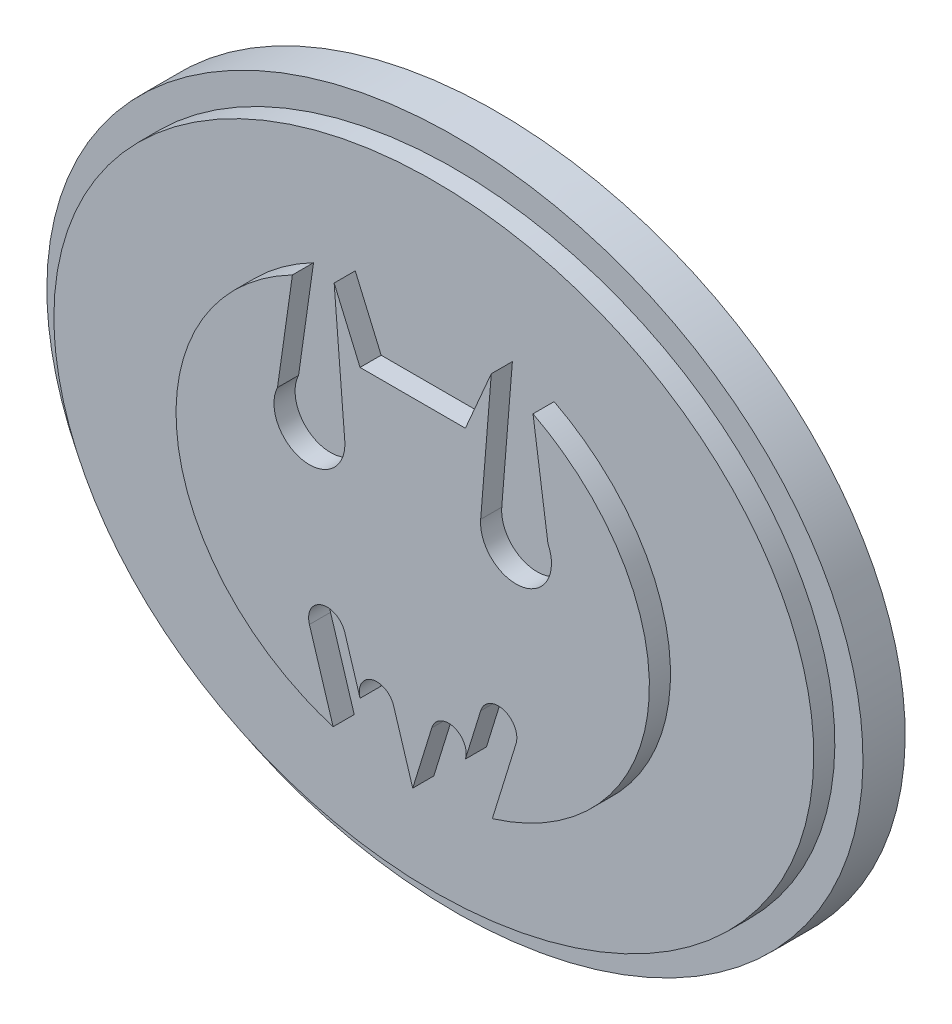
ISO-10303-21;
HEADER;
FILE_DESCRIPTION(('STEP AP214'),'2;1');
FILE_NAME('part.step','',(''),(''),'','','');
FILE_SCHEMA(('AUTOMOTIVE_DESIGN { 1 0 10303 214 1 1 1 1 }'));
ENDSEC;
DATA;
#1=APPLICATION_CONTEXT('core data for automotive mechanical design processes');
#2=APPLICATION_PROTOCOL_DEFINITION('international standard','automotive_design',2000,#1);
#3=PRODUCT_CONTEXT('',#1,'mechanical');
#4=PRODUCT('Part','Part','',(#3));
#5=PRODUCT_RELATED_PRODUCT_CATEGORY('part','',(#4));
#6=PRODUCT_DEFINITION_FORMATION('','',#4);
#7=PRODUCT_DEFINITION_CONTEXT('part definition',#1,'design');
#8=PRODUCT_DEFINITION('design','',#6,#7);
#9=PRODUCT_DEFINITION_SHAPE('','',#8);
#10=(LENGTH_UNIT() NAMED_UNIT(*) SI_UNIT(.MILLI.,.METRE.));
#11=(NAMED_UNIT(*) PLANE_ANGLE_UNIT() SI_UNIT($,.RADIAN.));
#12=(NAMED_UNIT(*) SI_UNIT($,.STERADIAN.) SOLID_ANGLE_UNIT());
#13=UNCERTAINTY_MEASURE_WITH_UNIT(LENGTH_MEASURE(1.E-05),#10,'distance_accuracy_value','');
#14=(GEOMETRIC_REPRESENTATION_CONTEXT(3) GLOBAL_UNCERTAINTY_ASSIGNED_CONTEXT((#13)) GLOBAL_UNIT_ASSIGNED_CONTEXT((#10,
#11,#12)) REPRESENTATION_CONTEXT('',''));
#15=CARTESIAN_POINT('',(0.,0.,0.));
#16=DIRECTION('',(0.,0.,1.));
#17=DIRECTION('',(1.,0.,0.));
#18=AXIS2_PLACEMENT_3D('',#15,#16,#17);
#19=CARTESIAN_POINT('',(116.029359229975,0.,-18.));
#20=DIRECTION('',(0.,0.,1.));
#21=DIRECTION('',(1.,0.,0.));
#22=AXIS2_PLACEMENT_3D('',#19,#20,#21);
#23=PLANE('',#22);
#24=CARTESIAN_POINT('',(-116.029359229975,0.,-18.));
#25=CARTESIAN_POINT('',(-116.029359229975,6.37410052059736,-18.));
#26=CARTESIAN_POINT('',(-114.476175249798,19.1223015617921,-18.));
#27=CARTESIAN_POINT('',(-105.343366538804,43.4989187803982,-18.));
#28=CARTESIAN_POINT('',(-83.4660711148723,69.926962918081,-18.));
#29=CARTESIAN_POINT('',(-44.9628374445871,90.7021810250193,-18.));
#30=CARTESIAN_POINT('',(0.,97.932997494934,-18.));
#31=CARTESIAN_POINT('',(44.9628374445871,90.7021810250193,-18.));
#32=CARTESIAN_POINT('',(83.4660711148723,69.926962918081,-18.));
#33=CARTESIAN_POINT('',(105.343366538804,43.4989187803982,-18.));
#34=CARTESIAN_POINT('',(114.476175249798,19.1223015617921,-18.));
#35=CARTESIAN_POINT('',(116.805951220064,0.,-18.));
#36=CARTESIAN_POINT('',(114.476175249798,-19.122301561792,-18.));
#37=CARTESIAN_POINT('',(105.343366538804,-43.4989187803982,-18.));
#38=CARTESIAN_POINT('',(83.4660711148723,-69.926962918081,-18.));
#39=CARTESIAN_POINT('',(44.9628374445871,-90.7021810250192,-18.));
#40=CARTESIAN_POINT('',(0.,-97.932997494934,-18.));
#41=CARTESIAN_POINT('',(-44.9628374445871,-90.7021810250192,-18.));
#42=CARTESIAN_POINT('',(-83.4660711148723,-69.926962918081,-18.));
#43=CARTESIAN_POINT('',(-105.343366538804,-43.4989187803982,-18.));
#44=CARTESIAN_POINT('',(-114.476175249798,-19.1223015617921,-18.));
#45=CARTESIAN_POINT('',(-116.029359229975,-6.37410052059737,-18.));
#46=CARTESIAN_POINT('',(-116.029359229975,0.,-18.));
#47=B_SPLINE_CURVE_WITH_KNOTS('',3,(#24,#25,#26,#27,#28,#29,#30,#31,#32,#33,#34,#35,#36,#37,#38,
#39,#40,#41,#42,#43,#44,#45,#46),.UNSPECIFIED.,.T.,.F.,(4,1,1,1,1,1,1,1,1,1,1,1,1,1,1,1,1,1,1,1,
4),(0.,0.196349540849362,0.392699081698724,0.785398163397448,1.17809724509617,1.5707963267949,
1.96349540849362,2.35619449019234,2.74889357189107,2.94524311274043,3.14159265358979,
3.33794219443916,3.53429173528852,3.92699081698724,4.31968989868597,4.71238898038469,
5.10508806208341,5.49778714378214,5.89048622548086,6.08683576633022,6.28318530717959),.UNSPECIFIED.);
#48=CARTESIAN_POINT('',(-116.029359229975,0.,-18.));
#49=VERTEX_POINT('',#48);
#50=EDGE_CURVE('E11',#49,#49,#47,.T.);
#51=ORIENTED_EDGE('',*,*,#50,.T.);
#52=EDGE_LOOP('',(#51));
#53=FACE_BOUND('',#52,.T.);
#54=CARTESIAN_POINT('',(0.,0.,-18.));
#55=DIRECTION('',(0.,0.,-1.));
#56=DIRECTION('',(-1.,0.,0.));
#57=AXIS2_PLACEMENT_3D('',#54,#55,#56);
#58=ELLIPSE('',#57,108.029359229975,87.5227253382957);
#59=CARTESIAN_POINT('',(-108.029359229975,0.,-18.));
#60=VERTEX_POINT('',#59);
#61=EDGE_CURVE('E66',#60,#60,#58,.T.);
#62=ORIENTED_EDGE('',*,*,#61,.F.);
#63=EDGE_LOOP('',(#62));
#64=FACE_BOUND('',#63,.T.);
#65=ADVANCED_FACE('F53',(#53,#64),#23,.F.);
#66=CARTESIAN_POINT('',(116.029359229975,0.,-6.));
#67=DIRECTION('',(0.,0.,1.));
#68=DIRECTION('',(1.,0.,0.));
#69=AXIS2_PLACEMENT_3D('',#66,#67,#68);
#70=PLANE('',#69);
#71=CARTESIAN_POINT('',(-116.029359229975,0.,-6.));
#72=CARTESIAN_POINT('',(-116.029359229975,6.37410052059736,-6.));
#73=CARTESIAN_POINT('',(-114.476175249798,19.1223015617921,-6.));
#74=CARTESIAN_POINT('',(-105.343366538804,43.4989187803982,-6.));
#75=CARTESIAN_POINT('',(-83.4660711148723,69.926962918081,-6.));
#76=CARTESIAN_POINT('',(-44.9628374445871,90.7021810250193,-6.));
#77=CARTESIAN_POINT('',(0.,97.932997494934,-6.));
#78=CARTESIAN_POINT('',(44.9628374445871,90.7021810250193,-6.));
#79=CARTESIAN_POINT('',(83.4660711148723,69.926962918081,-6.));
#80=CARTESIAN_POINT('',(105.343366538804,43.4989187803982,-6.));
#81=CARTESIAN_POINT('',(114.476175249798,19.1223015617921,-6.));
#82=CARTESIAN_POINT('',(116.805951220064,0.,-6.));
#83=CARTESIAN_POINT('',(114.476175249798,-19.122301561792,-6.));
#84=CARTESIAN_POINT('',(105.343366538804,-43.4989187803982,-6.));
#85=CARTESIAN_POINT('',(83.4660711148723,-69.926962918081,-6.));
#86=CARTESIAN_POINT('',(44.9628374445871,-90.7021810250192,-6.));
#87=CARTESIAN_POINT('',(0.,-97.932997494934,-6.));
#88=CARTESIAN_POINT('',(-44.9628374445871,-90.7021810250192,-6.));
#89=CARTESIAN_POINT('',(-83.4660711148723,-69.926962918081,-6.));
#90=CARTESIAN_POINT('',(-105.343366538804,-43.4989187803982,-6.));
#91=CARTESIAN_POINT('',(-114.476175249798,-19.1223015617921,-6.));
#92=CARTESIAN_POINT('',(-116.029359229975,-6.37410052059737,-6.));
#93=CARTESIAN_POINT('',(-116.029359229975,0.,-6.));
#94=B_SPLINE_CURVE_WITH_KNOTS('',3,(#71,#72,#73,#74,#75,#76,#77,#78,#79,#80,#81,#82,#83,#84,#85,
#86,#87,#88,#89,#90,#91,#92,#93),.UNSPECIFIED.,.T.,.F.,(4,1,1,1,1,1,1,1,1,1,1,1,1,1,1,1,1,1,1,1,
4),(0.,0.196349540849362,0.392699081698724,0.785398163397448,1.17809724509617,1.5707963267949,
1.96349540849362,2.35619449019234,2.74889357189107,2.94524311274043,3.14159265358979,
3.33794219443916,3.53429173528852,3.92699081698724,4.31968989868597,4.71238898038469,
5.10508806208341,5.49778714378214,5.89048622548086,6.08683576633022,6.28318530717959),.UNSPECIFIED.);
#95=CARTESIAN_POINT('',(-116.029359229975,0.,-6.));
#96=VERTEX_POINT('',#95);
#97=EDGE_CURVE('E58',#96,#96,#94,.T.);
#98=ORIENTED_EDGE('',*,*,#97,.F.);
#99=EDGE_LOOP('',(#98));
#100=FACE_BOUND('',#99,.T.);
#101=CARTESIAN_POINT('',(0.,0.,-6.));
#102=DIRECTION('',(0.,0.,-1.));
#103=DIRECTION('',(-1.,0.,0.));
#104=AXIS2_PLACEMENT_3D('',#101,#102,#103);
#105=ELLIPSE('',#104,108.029359229975,87.5227253382957);
#106=CARTESIAN_POINT('',(-108.029359229975,0.,-6.));
#107=VERTEX_POINT('',#106);
#108=EDGE_CURVE('E71',#107,#107,#105,.T.);
#109=ORIENTED_EDGE('',*,*,#108,.T.);
#110=EDGE_LOOP('',(#109));
#111=FACE_BOUND('',#110,.T.);
#112=ADVANCED_FACE('F85',(#100,#111),#70,.T.);
#113=DIRECTION('',(0.,0.,1.));
#114=VECTOR('',#113,1.);
#115=SURFACE_OF_LINEAR_EXTRUSION('',#47,#114);
#116=ORIENTED_EDGE('',*,*,#50,.F.);
#117=EDGE_LOOP('',(#116));
#118=FACE_BOUND('',#117,.T.);
#119=ORIENTED_EDGE('',*,*,#97,.T.);
#120=EDGE_LOOP('',(#119));
#121=FACE_BOUND('',#120,.T.);
#122=ADVANCED_FACE('F55',(#118,#121),#115,.F.);
#123=DIRECTION('',(0.,0.,1.));
#124=VECTOR('',#123,1.);
#125=SURFACE_OF_LINEAR_EXTRUSION('',#58,#124);
#126=ORIENTED_EDGE('',*,*,#61,.T.);
#127=EDGE_LOOP('',(#126));
#128=FACE_BOUND('',#127,.T.);
#129=ORIENTED_EDGE('',*,*,#108,.F.);
#130=EDGE_LOOP('',(#129));
#131=FACE_BOUND('',#130,.T.);
#132=ADVANCED_FACE('F80',(#128,#131),#125,.T.);
#133=CLOSED_SHELL('',(#65,#112,#122,#132));
#134=MANIFOLD_SOLID_BREP('B2',#133);
#135=CARTESIAN_POINT('',(0.,-59.0248580460068,6.));
#136=DIRECTION('',(0.955454385003465,0.295138811710102,0.));
#137=DIRECTION('',(-0.295138811710102,0.955454385003465,0.));
#138=AXIS2_PLACEMENT_3D('',#135,#136,#137);
#139=PLANE('',#138);
#140=DIRECTION('',(0.295138811710102,-0.955454385003465,0.));
#141=VECTOR('',#140,1.);
#142=CARTESIAN_POINT('',(0.,-59.0248580460068,0.));
#143=LINE('',#142,#141);
#144=CARTESIAN_POINT('',(-5.43463343842709,-41.431291413598,0.));
#145=VERTEX_POINT('',#144);
#146=CARTESIAN_POINT('',(0.,-59.0248580460068,0.));
#147=VERTEX_POINT('',#146);
#148=EDGE_CURVE('E286',#145,#147,#143,.T.);
#149=ORIENTED_EDGE('',*,*,#148,.T.);
#150=DIRECTION('',(0.,0.,-1.));
#151=VECTOR('',#150,1.);
#152=CARTESIAN_POINT('',(0.,-59.0248580460068,6.));
#153=LINE('',#152,#151);
#154=CARTESIAN_POINT('',(0.,-59.0248580460068,6.));
#155=VERTEX_POINT('',#154);
#156=EDGE_CURVE('E51',#155,#147,#153,.T.);
#157=ORIENTED_EDGE('',*,*,#156,.F.);
#158=DIRECTION('',(0.295138811710102,-0.955454385003465,0.));
#159=VECTOR('',#158,1.);
#160=CARTESIAN_POINT('',(0.,-59.0248580460068,6.));
#161=LINE('',#160,#159);
#162=CARTESIAN_POINT('',(-5.43463343842709,-41.431291413598,6.));
#163=VERTEX_POINT('',#162);
#164=EDGE_CURVE('E385',#163,#155,#161,.T.);
#165=ORIENTED_EDGE('',*,*,#164,.F.);
#166=DIRECTION('',(0.,0.,-1.));
#167=VECTOR('',#166,1.);
#168=CARTESIAN_POINT('',(-5.43463343842709,-41.431291413598,6.));
#169=LINE('',#168,#167);
#170=EDGE_CURVE('E301',#163,#145,#169,.T.);
#171=ORIENTED_EDGE('',*,*,#170,.T.);
#172=EDGE_LOOP('',(#149,#157,#165,#171));
#173=FACE_BOUND('',#172,.T.);
#174=ADVANCED_FACE('F143',(#173),#139,.F.);
#175=CARTESIAN_POINT('',(0.,-59.0248580460068,6.));
#176=DIRECTION('',(-0.955454385003465,0.295138811710102,0.));
#177=DIRECTION('',(-0.295138811710102,-0.955454385003465,0.));
#178=AXIS2_PLACEMENT_3D('',#175,#176,#177);
#179=PLANE('',#178);
#180=DIRECTION('',(0.295138811710102,0.955454385003465,0.));
#181=VECTOR('',#180,1.);
#182=CARTESIAN_POINT('',(0.,-59.0248580460068,0.));
#183=LINE('',#182,#181);
#184=CARTESIAN_POINT('',(5.43463343842709,-41.431291413598,0.));
#185=VERTEX_POINT('',#184);
#186=EDGE_CURVE('E282',#147,#185,#183,.T.);
#187=ORIENTED_EDGE('',*,*,#186,.T.);
#188=DIRECTION('',(0.,0.,-1.));
#189=VECTOR('',#188,1.);
#190=CARTESIAN_POINT('',(5.43463343842709,-41.431291413598,6.));
#191=LINE('',#190,#189);
#192=CARTESIAN_POINT('',(5.43463343842709,-41.431291413598,6.));
#193=VERTEX_POINT('',#192);
#194=EDGE_CURVE('E152',#193,#185,#191,.T.);
#195=ORIENTED_EDGE('',*,*,#194,.F.);
#196=DIRECTION('',(0.295138811710102,0.955454385003465,0.));
#197=VECTOR('',#196,1.);
#198=CARTESIAN_POINT('',(0.,-59.0248580460068,6.));
#199=LINE('',#198,#197);
#200=EDGE_CURVE('E297',#155,#193,#199,.T.);
#201=ORIENTED_EDGE('',*,*,#200,.F.);
#202=ORIENTED_EDGE('',*,*,#156,.T.);
#203=EDGE_LOOP('',(#187,#195,#201,#202));
#204=FACE_BOUND('',#203,.T.);
#205=ADVANCED_FACE('F296',(#204),#179,.F.);
#206=CARTESIAN_POINT('',(10.2034619854579,-42.9043773219481,6.));
#207=DIRECTION('',(0.,0.,-1.));
#208=DIRECTION('',(-1.,0.,0.));
#209=AXIS2_PLACEMENT_3D('',#206,#207,#208);
#210=CYLINDRICAL_SURFACE('',#209,4.99116297112766);
#211=CARTESIAN_POINT('',(10.2034619854579,-42.9043773219481,0.));
#212=DIRECTION('',(0.,0.,-1.));
#213=DIRECTION('',(-1.,0.,0.));
#214=AXIS2_PLACEMENT_3D('',#211,#212,#213);
#215=CIRCLE('',#214,4.99116297112766);
#216=CARTESIAN_POINT('',(14.9722905324888,-44.3774632302982,0.));
#217=VERTEX_POINT('',#216);
#218=EDGE_CURVE('E289',#185,#217,#215,.T.);
#219=ORIENTED_EDGE('',*,*,#218,.T.);
#220=DIRECTION('',(0.,0.,-1.));
#221=VECTOR('',#220,1.);
#222=CARTESIAN_POINT('',(14.9722905324888,-44.3774632302982,6.));
#223=LINE('',#222,#221);
#224=CARTESIAN_POINT('',(14.9722905324888,-44.3774632302982,6.));
#225=VERTEX_POINT('',#224);
#226=EDGE_CURVE('E456',#225,#217,#223,.T.);
#227=ORIENTED_EDGE('',*,*,#226,.F.);
#228=CARTESIAN_POINT('',(10.2034619854579,-42.9043773219481,6.));
#229=DIRECTION('',(0.,0.,-1.));
#230=DIRECTION('',(-1.,0.,0.));
#231=AXIS2_PLACEMENT_3D('',#228,#229,#230);
#232=CIRCLE('',#231,4.99116297112766);
#233=EDGE_CURVE('E464',#193,#225,#232,.T.);
#234=ORIENTED_EDGE('',*,*,#233,.F.);
#235=ORIENTED_EDGE('',*,*,#194,.T.);
#236=EDGE_LOOP('',(#219,#227,#234,#235));
#237=FACE_BOUND('',#236,.T.);
#238=ADVANCED_FACE('F462',(#237),#210,.F.);
#239=CARTESIAN_POINT('',(14.9722905324888,-44.3774632302982,6.));
#240=DIRECTION('',(-0.955454385003465,0.295138811710102,0.));
#241=DIRECTION('',(-0.295138811710102,-0.955454385003465,0.));
#242=AXIS2_PLACEMENT_3D('',#239,#240,#241);
#243=PLANE('',#242);
#244=DIRECTION('',(0.295138811710102,0.955454385003465,0.));
#245=VECTOR('',#244,1.);
#246=CARTESIAN_POINT('',(14.9722905324888,-44.3774632302982,0.));
#247=LINE('',#246,#245);
#248=CARTESIAN_POINT('',(19.3201927450069,-30.3019771549623,0.));
#249=VERTEX_POINT('',#248);
#250=EDGE_CURVE('E314',#217,#249,#247,.T.);
#251=ORIENTED_EDGE('',*,*,#250,.T.);
#252=DIRECTION('',(0.,0.,-1.));
#253=VECTOR('',#252,1.);
#254=CARTESIAN_POINT('',(19.3201927450069,-30.3019771549623,6.));
#255=LINE('',#254,#253);
#256=CARTESIAN_POINT('',(19.3201927450069,-30.3019771549623,6.));
#257=VERTEX_POINT('',#256);
#258=EDGE_CURVE('E452',#257,#249,#255,.T.);
#259=ORIENTED_EDGE('',*,*,#258,.F.);
#260=DIRECTION('',(0.295138811710102,0.955454385003465,0.));
#261=VECTOR('',#260,1.);
#262=CARTESIAN_POINT('',(14.9722905324888,-44.3774632302982,6.));
#263=LINE('',#262,#261);
#264=EDGE_CURVE('E467',#225,#257,#263,.T.);
#265=ORIENTED_EDGE('',*,*,#264,.F.);
#266=ORIENTED_EDGE('',*,*,#226,.T.);
#267=EDGE_LOOP('',(#251,#259,#265,#266));
#268=FACE_BOUND('',#267,.T.);
#269=ADVANCED_FACE('F502',(#268),#243,.F.);
#270=CARTESIAN_POINT('',(24.3455936726926,-31.8543179903217,6.));
#271=DIRECTION('',(0.,0.,-1.));
#272=DIRECTION('',(-1.,0.,0.));
#273=AXIS2_PLACEMENT_3D('',#270,#271,#272);
#274=CYLINDRICAL_SURFACE('',#273,5.25969738227479);
#275=CARTESIAN_POINT('',(24.3455936726926,-31.8543179903217,0.));
#276=DIRECTION('',(0.,0.,-1.));
#277=DIRECTION('',(-1.,0.,0.));
#278=AXIS2_PLACEMENT_3D('',#275,#276,#277);
#279=CIRCLE('',#278,5.25969738227479);
#280=CARTESIAN_POINT('',(29.3709946003783,-33.406658825681,0.));
#281=VERTEX_POINT('',#280);
#282=EDGE_CURVE('E318',#249,#281,#279,.T.);
#283=ORIENTED_EDGE('',*,*,#282,.T.);
#284=DIRECTION('',(0.,0.,-1.));
#285=VECTOR('',#284,1.);
#286=CARTESIAN_POINT('',(29.3709946003783,-33.406658825681,6.));
#287=LINE('',#286,#285);
#288=CARTESIAN_POINT('',(29.3709946003783,-33.406658825681,6.));
#289=VERTEX_POINT('',#288);
#290=EDGE_CURVE('E448',#289,#281,#287,.T.);
#291=ORIENTED_EDGE('',*,*,#290,.F.);
#292=CARTESIAN_POINT('',(24.3455936726926,-31.8543179903217,6.));
#293=DIRECTION('',(0.,0.,-1.));
#294=DIRECTION('',(-1.,0.,0.));
#295=AXIS2_PLACEMENT_3D('',#292,#293,#294);
#296=CIRCLE('',#295,5.25969738227479);
#297=EDGE_CURVE('E471',#257,#289,#296,.T.);
#298=ORIENTED_EDGE('',*,*,#297,.F.);
#299=ORIENTED_EDGE('',*,*,#258,.T.);
#300=EDGE_LOOP('',(#283,#291,#298,#299));
#301=FACE_BOUND('',#300,.T.);
#302=ADVANCED_FACE('F498',(#301),#274,.F.);
#303=CARTESIAN_POINT('',(29.3709946003783,-33.406658825681,6.));
#304=DIRECTION('',(0.955454385003465,-0.295138811710102,0.));
#305=DIRECTION('',(0.295138811710102,0.955454385003465,0.));
#306=AXIS2_PLACEMENT_3D('',#303,#304,#305);
#307=PLANE('',#306);
#308=DIRECTION('',(-0.295138811710101,-0.955454385003465,0.));
#309=VECTOR('',#308,1.);
#310=CARTESIAN_POINT('',(29.3709946003783,-33.406658825681,0.));
#311=LINE('',#310,#309);
#312=CARTESIAN_POINT('',(22.633437569499,-55.2181866693577,0.));
#313=VERTEX_POINT('',#312);
#314=EDGE_CURVE('E322',#281,#313,#311,.T.);
#315=ORIENTED_EDGE('',*,*,#314,.T.);
#316=DIRECTION('',(0.,0.,-1.));
#317=VECTOR('',#316,1.);
#318=CARTESIAN_POINT('',(22.633437569499,-55.2181866693577,6.));
#319=LINE('',#318,#317);
#320=CARTESIAN_POINT('',(22.633437569499,-55.2181866693577,6.));
#321=VERTEX_POINT('',#320);
#322=EDGE_CURVE('E444',#321,#313,#319,.T.);
#323=ORIENTED_EDGE('',*,*,#322,.F.);
#324=DIRECTION('',(-0.295138811710101,-0.955454385003465,0.));
#325=VECTOR('',#324,1.);
#326=CARTESIAN_POINT('',(29.3709946003783,-33.406658825681,6.));
#327=LINE('',#326,#325);
#328=EDGE_CURVE('E478',#289,#321,#327,.T.);
#329=ORIENTED_EDGE('',*,*,#328,.F.);
#330=ORIENTED_EDGE('',*,*,#290,.T.);
#331=EDGE_LOOP('',(#315,#323,#329,#330));
#332=FACE_BOUND('',#331,.T.);
#333=ADVANCED_FACE('F493',(#332),#307,.F.);
#334=CARTESIAN_POINT('',(0.,0.,6.));
#335=DIRECTION('',(0.,0.,1.));
#336=DIRECTION('',(0.999847622623145,-0.0174565613694307,0.));
#337=AXIS2_PLACEMENT_3D('',#334,#335,#336);
#338=ELLIPSE('',#337,67.303682037696,58.5288740300932);
#339=DIRECTION('',(0.,0.,-1.));
#340=VECTOR('',#339,1.);
#341=SURFACE_OF_LINEAR_EXTRUSION('',#338,#340);
#342=CARTESIAN_POINT('',(0.,0.,0.));
#343=DIRECTION('',(0.,0.,1.));
#344=DIRECTION('',(0.999847622623145,-0.0174565613694307,0.));
#345=AXIS2_PLACEMENT_3D('',#342,#343,#344);
#346=ELLIPSE('',#345,67.303682037696,58.5288740300932);
#347=CARTESIAN_POINT('',(34.2052894608367,50.2622382117793,0.));
#348=VERTEX_POINT('',#347);
#349=EDGE_CURVE('E326',#313,#348,#346,.T.);
#350=ORIENTED_EDGE('',*,*,#349,.T.);
#351=DIRECTION('',(0.,0.,-1.));
#352=VECTOR('',#351,1.);
#353=CARTESIAN_POINT('',(34.2052894608367,50.2622382117793,6.));
#354=LINE('',#353,#352);
#355=CARTESIAN_POINT('',(34.2052894608367,50.2622382117793,6.));
#356=VERTEX_POINT('',#355);
#357=EDGE_CURVE('E440',#356,#348,#354,.T.);
#358=ORIENTED_EDGE('',*,*,#357,.F.);
#359=EDGE_CURVE('E481',#321,#356,#338,.T.);
#360=ORIENTED_EDGE('',*,*,#359,.F.);
#361=ORIENTED_EDGE('',*,*,#322,.T.);
#362=EDGE_LOOP('',(#350,#358,#360,#361));
#363=FACE_BOUND('',#362,.T.);
#364=ADVANCED_FACE('F488',(#363),#341,.F.);
#365=CARTESIAN_POINT('',(38.4555133924008,20.3969782368728,6.));
#366=DIRECTION('',(0.990024730484139,0.140893694073967,0.));
#367=DIRECTION('',(-0.140893694073967,0.990024730484139,0.));
#368=AXIS2_PLACEMENT_3D('',#365,#366,#367);
#369=PLANE('',#368);
#370=DIRECTION('',(0.140893694073967,-0.990024730484139,0.));
#371=VECTOR('',#370,1.);
#372=CARTESIAN_POINT('',(38.4555133924008,20.3969782368728,0.));
#373=LINE('',#372,#371);
#374=CARTESIAN_POINT('',(38.4555133924008,20.3969782368728,0.));
#375=VERTEX_POINT('',#374);
#376=EDGE_CURVE('E330',#348,#375,#373,.T.);
#377=ORIENTED_EDGE('',*,*,#376,.T.);
#378=DIRECTION('',(0.,0.,-1.));
#379=VECTOR('',#378,1.);
#380=CARTESIAN_POINT('',(38.4555133924008,20.3969782368728,6.));
#381=LINE('',#380,#379);
#382=CARTESIAN_POINT('',(38.4555133924008,20.3969782368728,6.));
#383=VERTEX_POINT('',#382);
#384=EDGE_CURVE('E436',#383,#375,#381,.T.);
#385=ORIENTED_EDGE('',*,*,#384,.F.);
#386=DIRECTION('',(0.140893694073967,-0.990024730484139,0.));
#387=VECTOR('',#386,1.);
#388=CARTESIAN_POINT('',(38.4555133924008,20.3969782368728,6.));
#389=LINE('',#388,#387);
#390=EDGE_CURVE('E485',#356,#383,#389,.T.);
#391=ORIENTED_EDGE('',*,*,#390,.F.);
#392=ORIENTED_EDGE('',*,*,#357,.T.);
#393=EDGE_LOOP('',(#377,#385,#391,#392));
#394=FACE_BOUND('',#393,.T.);
#395=ADVANCED_FACE('F492',(#394),#369,.F.);
#396=CARTESIAN_POINT('',(29.3709946003783,16.0208154461117,6.));
#397=DIRECTION('',(0.,0.,-1.));
#398=DIRECTION('',(-1.,0.,0.));
#399=AXIS2_PLACEMENT_3D('',#396,#397,#398);
#400=CYLINDRICAL_SURFACE('',#399,10.0836145530188);
#401=CARTESIAN_POINT('',(29.3709946003783,16.0208154461117,0.));
#402=DIRECTION('',(0.,0.,-1.));
#403=DIRECTION('',(1.,0.,0.));
#404=AXIS2_PLACEMENT_3D('',#401,#402,#403);
#405=CIRCLE('',#404,10.0836145530188);
#406=CARTESIAN_POINT('',(19.3201927450069,16.8336281661861,0.));
#407=VERTEX_POINT('',#406);
#408=EDGE_CURVE('E334',#375,#407,#405,.T.);
#409=ORIENTED_EDGE('',*,*,#408,.T.);
#410=DIRECTION('',(0.,0.,-1.));
#411=VECTOR('',#410,1.);
#412=CARTESIAN_POINT('',(19.3201927450069,16.8336281661861,6.));
#413=LINE('',#412,#411);
#414=CARTESIAN_POINT('',(19.3201927450069,16.8336281661861,6.));
#415=VERTEX_POINT('',#414);
#416=EDGE_CURVE('E432',#415,#407,#413,.T.);
#417=ORIENTED_EDGE('',*,*,#416,.F.);
#418=CARTESIAN_POINT('',(29.3709946003783,16.0208154461117,6.));
#419=DIRECTION('',(0.,0.,-1.));
#420=DIRECTION('',(1.,0.,0.));
#421=AXIS2_PLACEMENT_3D('',#418,#419,#420);
#422=CIRCLE('',#421,10.0836145530188);
#423=EDGE_CURVE('E880',#383,#415,#422,.T.);
#424=ORIENTED_EDGE('',*,*,#423,.F.);
#425=ORIENTED_EDGE('',*,*,#384,.T.);
#426=EDGE_LOOP('',(#409,#417,#424,#425));
#427=FACE_BOUND('',#426,.T.);
#428=ADVANCED_FACE('F538',(#427),#400,.F.);
#429=CARTESIAN_POINT('',(22.3416164980028,54.1949178119648,6.));
#430=DIRECTION('',(-0.99674593892152,0.0806072778566402,0.));
#431=DIRECTION('',(-0.0806072778566402,-0.99674593892152,0.));
#432=AXIS2_PLACEMENT_3D('',#429,#430,#431);
#433=PLANE('',#432);
#434=DIRECTION('',(0.0806072778566402,0.99674593892152,0.));
#435=VECTOR('',#434,1.);
#436=CARTESIAN_POINT('',(22.3416164980028,54.1949178119648,0.));
#437=LINE('',#436,#435);
#438=CARTESIAN_POINT('',(22.3416164980028,54.1949178119648,0.));
#439=VERTEX_POINT('',#438);
#440=EDGE_CURVE('E338',#407,#439,#437,.T.);
#441=ORIENTED_EDGE('',*,*,#440,.T.);
#442=DIRECTION('',(0.,0.,-1.));
#443=VECTOR('',#442,1.);
#444=CARTESIAN_POINT('',(22.3416164980028,54.1949178119648,6.));
#445=LINE('',#444,#443);
#446=CARTESIAN_POINT('',(22.3416164980028,54.1949178119648,6.));
#447=VERTEX_POINT('',#446);
#448=EDGE_CURVE('E428',#447,#439,#445,.T.);
#449=ORIENTED_EDGE('',*,*,#448,.F.);
#450=DIRECTION('',(0.0806072778566402,0.99674593892152,0.));
#451=VECTOR('',#450,1.);
#452=CARTESIAN_POINT('',(22.3416164980028,54.1949178119648,6.));
#453=LINE('',#452,#451);
#454=EDGE_CURVE('E876',#415,#447,#453,.T.);
#455=ORIENTED_EDGE('',*,*,#454,.F.);
#456=ORIENTED_EDGE('',*,*,#416,.T.);
#457=EDGE_LOOP('',(#441,#449,#455,#456));
#458=FACE_BOUND('',#457,.T.);
#459=ADVANCED_FACE('F543',(#458),#433,.F.);
#460=CARTESIAN_POINT('',(14.9722905324888,37.0971138199687,6.));
#461=DIRECTION('',(0.918332230205677,-0.395810453330213,0.));
#462=DIRECTION('',(0.395810453330213,0.918332230205677,0.));
#463=AXIS2_PLACEMENT_3D('',#460,#461,#462);
#464=PLANE('',#463);
#465=DIRECTION('',(-0.395810453330213,-0.918332230205676,0.));
#466=VECTOR('',#465,1.);
#467=CARTESIAN_POINT('',(14.9722905324888,37.0971138199687,0.));
#468=LINE('',#467,#466);
#469=CARTESIAN_POINT('',(14.9722905324888,37.0971138199687,0.));
#470=VERTEX_POINT('',#469);
#471=EDGE_CURVE('E342',#439,#470,#468,.T.);
#472=ORIENTED_EDGE('',*,*,#471,.T.);
#473=DIRECTION('',(0.,0.,-1.));
#474=VECTOR('',#473,1.);
#475=CARTESIAN_POINT('',(14.9722905324888,37.0971138199687,6.));
#476=LINE('',#475,#474);
#477=CARTESIAN_POINT('',(14.9722905324888,37.0971138199687,6.));
#478=VERTEX_POINT('',#477);
#479=EDGE_CURVE('E424',#478,#470,#476,.T.);
#480=ORIENTED_EDGE('',*,*,#479,.F.);
#481=DIRECTION('',(-0.395810453330213,-0.918332230205676,0.));
#482=VECTOR('',#481,1.);
#483=CARTESIAN_POINT('',(14.9722905324888,37.0971138199687,6.));
#484=LINE('',#483,#482);
#485=EDGE_CURVE('E874',#447,#478,#484,.T.);
#486=ORIENTED_EDGE('',*,*,#485,.F.);
#487=ORIENTED_EDGE('',*,*,#448,.T.);
#488=EDGE_LOOP('',(#472,#480,#486,#487));
#489=FACE_BOUND('',#488,.T.);
#490=ADVANCED_FACE('F554',(#489),#464,.F.);
#491=CARTESIAN_POINT('',(-14.9722905324888,37.0971138199687,6.));
#492=DIRECTION('',(0.,-1.,0.));
#493=DIRECTION('',(0.,0.,-1.));
#494=AXIS2_PLACEMENT_3D('',#491,#492,#493);
#495=PLANE('',#494);
#496=DIRECTION('',(-1.,0.,0.));
#497=VECTOR('',#496,1.);
#498=CARTESIAN_POINT('',(-14.9722905324888,37.0971138199687,0.));
#499=LINE('',#498,#497);
#500=CARTESIAN_POINT('',(-14.9722905324888,37.0971138199687,0.));
#501=VERTEX_POINT('',#500);
#502=EDGE_CURVE('E346',#470,#501,#499,.T.);
#503=ORIENTED_EDGE('',*,*,#502,.T.);
#504=DIRECTION('',(0.,0.,-1.));
#505=VECTOR('',#504,1.);
#506=CARTESIAN_POINT('',(-14.9722905324888,37.0971138199687,6.));
#507=LINE('',#506,#505);
#508=CARTESIAN_POINT('',(-14.9722905324888,37.0971138199687,6.));
#509=VERTEX_POINT('',#508);
#510=EDGE_CURVE('E420',#509,#501,#507,.T.);
#511=ORIENTED_EDGE('',*,*,#510,.F.);
#512=DIRECTION('',(-1.,0.,0.));
#513=VECTOR('',#512,1.);
#514=CARTESIAN_POINT('',(-14.9722905324888,37.0971138199687,6.));
#515=LINE('',#514,#513);
#516=EDGE_CURVE('E870',#478,#509,#515,.T.);
#517=ORIENTED_EDGE('',*,*,#516,.F.);
#518=ORIENTED_EDGE('',*,*,#479,.T.);
#519=EDGE_LOOP('',(#503,#511,#517,#518));
#520=FACE_BOUND('',#519,.T.);
#521=ADVANCED_FACE('F606',(#520),#495,.F.);
#522=CARTESIAN_POINT('',(-14.9722905324888,37.0971138199687,6.));
#523=DIRECTION('',(-0.918332230205677,-0.395810453330213,0.));
#524=DIRECTION('',(0.395810453330213,-0.918332230205677,0.));
#525=AXIS2_PLACEMENT_3D('',#522,#523,#524);
#526=PLANE('',#525);
#527=DIRECTION('',(-0.395810453330213,0.918332230205676,0.));
#528=VECTOR('',#527,1.);
#529=CARTESIAN_POINT('',(-14.9722905324888,37.0971138199687,0.));
#530=LINE('',#529,#528);
#531=CARTESIAN_POINT('',(-22.3416164980028,54.1949178119648,0.));
#532=VERTEX_POINT('',#531);
#533=EDGE_CURVE('E350',#501,#532,#530,.T.);
#534=ORIENTED_EDGE('',*,*,#533,.T.);
#535=DIRECTION('',(0.,0.,-1.));
#536=VECTOR('',#535,1.);
#537=CARTESIAN_POINT('',(-22.3416164980028,54.1949178119648,6.));
#538=LINE('',#537,#536);
#539=CARTESIAN_POINT('',(-22.3416164980028,54.1949178119648,6.));
#540=VERTEX_POINT('',#539);
#541=EDGE_CURVE('E416',#540,#532,#538,.T.);
#542=ORIENTED_EDGE('',*,*,#541,.F.);
#543=DIRECTION('',(-0.395810453330213,0.918332230205676,0.));
#544=VECTOR('',#543,1.);
#545=CARTESIAN_POINT('',(-14.9722905324888,37.0971138199687,6.));
#546=LINE('',#545,#544);
#547=EDGE_CURVE('E868',#509,#540,#546,.T.);
#548=ORIENTED_EDGE('',*,*,#547,.F.);
#549=ORIENTED_EDGE('',*,*,#510,.T.);
#550=EDGE_LOOP('',(#534,#542,#548,#549));
#551=FACE_BOUND('',#550,.T.);
#552=ADVANCED_FACE('F574',(#551),#526,.F.);
#553=CARTESIAN_POINT('',(-22.3416164980028,54.1949178119648,6.));
#554=DIRECTION('',(0.99674593892152,0.0806072778566402,0.));
#555=DIRECTION('',(-0.0806072778566402,0.99674593892152,0.));
#556=AXIS2_PLACEMENT_3D('',#553,#554,#555);
#557=PLANE('',#556);
#558=DIRECTION('',(0.0806072778566402,-0.99674593892152,0.));
#559=VECTOR('',#558,1.);
#560=CARTESIAN_POINT('',(-22.3416164980028,54.1949178119648,0.));
#561=LINE('',#560,#559);
#562=CARTESIAN_POINT('',(-19.3201927450069,16.8336281661861,0.));
#563=VERTEX_POINT('',#562);
#564=EDGE_CURVE('E354',#532,#563,#561,.T.);
#565=ORIENTED_EDGE('',*,*,#564,.T.);
#566=DIRECTION('',(0.,0.,-1.));
#567=VECTOR('',#566,1.);
#568=CARTESIAN_POINT('',(-19.3201927450069,16.8336281661861,6.));
#569=LINE('',#568,#567);
#570=CARTESIAN_POINT('',(-19.3201927450069,16.8336281661861,6.));
#571=VERTEX_POINT('',#570);
#572=EDGE_CURVE('E412',#571,#563,#569,.T.);
#573=ORIENTED_EDGE('',*,*,#572,.F.);
#574=DIRECTION('',(0.0806072778566402,-0.99674593892152,0.));
#575=VECTOR('',#574,1.);
#576=CARTESIAN_POINT('',(-22.3416164980028,54.1949178119648,6.));
#577=LINE('',#576,#575);
#578=EDGE_CURVE('E864',#540,#571,#577,.T.);
#579=ORIENTED_EDGE('',*,*,#578,.F.);
#580=ORIENTED_EDGE('',*,*,#541,.T.);
#581=EDGE_LOOP('',(#565,#573,#579,#580));
#582=FACE_BOUND('',#581,.T.);
#583=ADVANCED_FACE('F568',(#582),#557,.F.);
#584=CARTESIAN_POINT('',(-29.3709946003783,16.0208154461117,6.));
#585=DIRECTION('',(0.,0.,-1.));
#586=DIRECTION('',(-1.,0.,0.));
#587=AXIS2_PLACEMENT_3D('',#584,#585,#586);
#588=CYLINDRICAL_SURFACE('',#587,10.0836145530188);
#589=CARTESIAN_POINT('',(-29.3709946003783,16.0208154461117,0.));
#590=DIRECTION('',(0.,0.,-1.));
#591=DIRECTION('',(-1.,0.,0.));
#592=AXIS2_PLACEMENT_3D('',#589,#590,#591);
#593=CIRCLE('',#592,10.0836145530188);
#594=CARTESIAN_POINT('',(-38.4555133924008,20.3969782368728,0.));
#595=VERTEX_POINT('',#594);
#596=EDGE_CURVE('E358',#563,#595,#593,.T.);
#597=ORIENTED_EDGE('',*,*,#596,.T.);
#598=DIRECTION('',(0.,0.,-1.));
#599=VECTOR('',#598,1.);
#600=CARTESIAN_POINT('',(-38.4555133924008,20.3969782368728,6.));
#601=LINE('',#600,#599);
#602=CARTESIAN_POINT('',(-38.4555133924008,20.3969782368728,6.));
#603=VERTEX_POINT('',#602);
#604=EDGE_CURVE('E408',#603,#595,#601,.T.);
#605=ORIENTED_EDGE('',*,*,#604,.F.);
#606=CARTESIAN_POINT('',(-29.3709946003783,16.0208154461117,6.));
#607=DIRECTION('',(0.,0.,-1.));
#608=DIRECTION('',(-1.,0.,0.));
#609=AXIS2_PLACEMENT_3D('',#606,#607,#608);
#610=CIRCLE('',#609,10.0836145530188);
#611=EDGE_CURVE('E862',#571,#603,#610,.T.);
#612=ORIENTED_EDGE('',*,*,#611,.F.);
#613=ORIENTED_EDGE('',*,*,#572,.T.);
#614=EDGE_LOOP('',(#597,#605,#612,#613));
#615=FACE_BOUND('',#614,.T.);
#616=ADVANCED_FACE('F573',(#615),#588,.F.);
#617=CARTESIAN_POINT('',(-38.4555133924008,20.3969782368728,6.));
#618=DIRECTION('',(-0.990024730484139,0.140893694073967,0.));
#619=DIRECTION('',(-0.140893694073967,-0.990024730484139,0.));
#620=AXIS2_PLACEMENT_3D('',#617,#618,#619);
#621=PLANE('',#620);
#622=DIRECTION('',(0.140893694073967,0.990024730484139,0.));
#623=VECTOR('',#622,1.);
#624=CARTESIAN_POINT('',(-38.4555133924008,20.3969782368728,0.));
#625=LINE('',#624,#623);
#626=CARTESIAN_POINT('',(-34.2052894608367,50.2622382117793,0.));
#627=VERTEX_POINT('',#626);
#628=EDGE_CURVE('E362',#595,#627,#625,.T.);
#629=ORIENTED_EDGE('',*,*,#628,.T.);
#630=DIRECTION('',(0.,0.,-1.));
#631=VECTOR('',#630,1.);
#632=CARTESIAN_POINT('',(-34.2052894608367,50.2622382117793,6.));
#633=LINE('',#632,#631);
#634=CARTESIAN_POINT('',(-34.2052894608367,50.2622382117793,6.));
#635=VERTEX_POINT('',#634);
#636=EDGE_CURVE('E404',#635,#627,#633,.T.);
#637=ORIENTED_EDGE('',*,*,#636,.F.);
#638=DIRECTION('',(0.140893694073967,0.990024730484139,0.));
#639=VECTOR('',#638,1.);
#640=CARTESIAN_POINT('',(-38.4555133924008,20.3969782368728,6.));
#641=LINE('',#640,#639);
#642=EDGE_CURVE('E833',#603,#635,#641,.T.);
#643=ORIENTED_EDGE('',*,*,#642,.F.);
#644=ORIENTED_EDGE('',*,*,#604,.T.);
#645=EDGE_LOOP('',(#629,#637,#643,#644));
#646=FACE_BOUND('',#645,.T.);
#647=ADVANCED_FACE('F586',(#646),#621,.F.);
#648=CARTESIAN_POINT('',(0.,0.,6.));
#649=DIRECTION('',(0.,0.,1.));
#650=DIRECTION('',(-0.999847622623145,-0.0174565613694307,0.));
#651=AXIS2_PLACEMENT_3D('',#648,#649,#650);
#652=ELLIPSE('',#651,67.303682037696,58.5288740300932);
#653=DIRECTION('',(0.,0.,-1.));
#654=VECTOR('',#653,1.);
#655=SURFACE_OF_LINEAR_EXTRUSION('',#652,#654);
#656=CARTESIAN_POINT('',(0.,0.,0.));
#657=DIRECTION('',(0.,0.,1.));
#658=DIRECTION('',(-0.999847622623145,-0.0174565613694307,0.));
#659=AXIS2_PLACEMENT_3D('',#656,#657,#658);
#660=ELLIPSE('',#659,67.303682037696,58.5288740300932);
#661=CARTESIAN_POINT('',(-22.633437569499,-55.2181866693577,0.));
#662=VERTEX_POINT('',#661);
#663=EDGE_CURVE('E366',#627,#662,#660,.T.);
#664=ORIENTED_EDGE('',*,*,#663,.T.);
#665=DIRECTION('',(0.,0.,-1.));
#666=VECTOR('',#665,1.);
#667=CARTESIAN_POINT('',(-22.633437569499,-55.2181866693577,6.));
#668=LINE('',#667,#666);
#669=CARTESIAN_POINT('',(-22.633437569499,-55.2181866693577,6.));
#670=VERTEX_POINT('',#669);
#671=EDGE_CURVE('E400',#670,#662,#668,.T.);
#672=ORIENTED_EDGE('',*,*,#671,.F.);
#673=EDGE_CURVE('E827',#635,#670,#652,.T.);
#674=ORIENTED_EDGE('',*,*,#673,.F.);
#675=ORIENTED_EDGE('',*,*,#636,.T.);
#676=EDGE_LOOP('',(#664,#672,#674,#675));
#677=FACE_BOUND('',#676,.T.);
#678=ADVANCED_FACE('F596',(#677),#655,.F.);
#679=CARTESIAN_POINT('',(-29.3709946003783,-33.406658825681,6.));
#680=DIRECTION('',(-0.955454385003465,-0.295138811710102,0.));
#681=DIRECTION('',(0.295138811710102,-0.955454385003465,0.));
#682=AXIS2_PLACEMENT_3D('',#679,#680,#681);
#683=PLANE('',#682);
#684=DIRECTION('',(-0.295138811710101,0.955454385003465,0.));
#685=VECTOR('',#684,1.);
#686=CARTESIAN_POINT('',(-29.3709946003783,-33.406658825681,0.));
#687=LINE('',#686,#685);
#688=CARTESIAN_POINT('',(-29.3709946003783,-33.406658825681,0.));
#689=VERTEX_POINT('',#688);
#690=EDGE_CURVE('E370',#662,#689,#687,.T.);
#691=ORIENTED_EDGE('',*,*,#690,.T.);
#692=DIRECTION('',(0.,0.,-1.));
#693=VECTOR('',#692,1.);
#694=CARTESIAN_POINT('',(-29.3709946003783,-33.406658825681,6.));
#695=LINE('',#694,#693);
#696=CARTESIAN_POINT('',(-29.3709946003783,-33.406658825681,6.));
#697=VERTEX_POINT('',#696);
#698=EDGE_CURVE('E396',#697,#689,#695,.T.);
#699=ORIENTED_EDGE('',*,*,#698,.F.);
#700=DIRECTION('',(-0.295138811710101,0.955454385003465,0.));
#701=VECTOR('',#700,1.);
#702=CARTESIAN_POINT('',(-29.3709946003783,-33.406658825681,6.));
#703=LINE('',#702,#701);
#704=EDGE_CURVE('E832',#670,#697,#703,.T.);
#705=ORIENTED_EDGE('',*,*,#704,.F.);
#706=ORIENTED_EDGE('',*,*,#671,.T.);
#707=EDGE_LOOP('',(#691,#699,#705,#706));
#708=FACE_BOUND('',#707,.T.);
#709=ADVANCED_FACE('F695',(#708),#683,.F.);
#710=CARTESIAN_POINT('',(-24.3455936726926,-31.8543179903217,6.));
#711=DIRECTION('',(0.,0.,-1.));
#712=DIRECTION('',(-1.,0.,0.));
#713=AXIS2_PLACEMENT_3D('',#710,#711,#712);
#714=CYLINDRICAL_SURFACE('',#713,5.25969738227479);
#715=CARTESIAN_POINT('',(-24.3455936726926,-31.8543179903217,0.));
#716=DIRECTION('',(0.,0.,-1.));
#717=DIRECTION('',(1.,0.,0.));
#718=AXIS2_PLACEMENT_3D('',#715,#716,#717);
#719=CIRCLE('',#718,5.25969738227479);
#720=CARTESIAN_POINT('',(-19.3201927450069,-30.3019771549623,0.));
#721=VERTEX_POINT('',#720);
#722=EDGE_CURVE('E374',#689,#721,#719,.T.);
#723=ORIENTED_EDGE('',*,*,#722,.T.);
#724=DIRECTION('',(0.,0.,-1.));
#725=VECTOR('',#724,1.);
#726=CARTESIAN_POINT('',(-19.3201927450069,-30.3019771549623,6.));
#727=LINE('',#726,#725);
#728=CARTESIAN_POINT('',(-19.3201927450069,-30.3019771549623,6.));
#729=VERTEX_POINT('',#728);
#730=EDGE_CURVE('E392',#729,#721,#727,.T.);
#731=ORIENTED_EDGE('',*,*,#730,.F.);
#732=CARTESIAN_POINT('',(-24.3455936726926,-31.8543179903217,6.));
#733=DIRECTION('',(0.,0.,-1.));
#734=DIRECTION('',(1.,0.,0.));
#735=AXIS2_PLACEMENT_3D('',#732,#733,#734);
#736=CIRCLE('',#735,5.25969738227479);
#737=EDGE_CURVE('E837',#697,#729,#736,.T.);
#738=ORIENTED_EDGE('',*,*,#737,.F.);
#739=ORIENTED_EDGE('',*,*,#698,.T.);
#740=EDGE_LOOP('',(#723,#731,#738,#739));
#741=FACE_BOUND('',#740,.T.);
#742=ADVANCED_FACE('F683',(#741),#714,.F.);
#743=CARTESIAN_POINT('',(-14.9722905324888,-44.3774632302982,6.));
#744=DIRECTION('',(0.955454385003465,0.295138811710102,0.));
#745=DIRECTION('',(-0.295138811710102,0.955454385003465,0.));
#746=AXIS2_PLACEMENT_3D('',#743,#744,#745);
#747=PLANE('',#746);
#748=DIRECTION('',(0.295138811710102,-0.955454385003465,0.));
#749=VECTOR('',#748,1.);
#750=CARTESIAN_POINT('',(-14.9722905324888,-44.3774632302982,0.));
#751=LINE('',#750,#749);
#752=CARTESIAN_POINT('',(-14.9722905324888,-44.3774632302982,0.));
#753=VERTEX_POINT('',#752);
#754=EDGE_CURVE('E378',#721,#753,#751,.T.);
#755=ORIENTED_EDGE('',*,*,#754,.T.);
#756=DIRECTION('',(0.,0.,-1.));
#757=VECTOR('',#756,1.);
#758=CARTESIAN_POINT('',(-14.9722905324888,-44.3774632302982,6.));
#759=LINE('',#758,#757);
#760=CARTESIAN_POINT('',(-14.9722905324888,-44.3774632302982,6.));
#761=VERTEX_POINT('',#760);
#762=EDGE_CURVE('E388',#761,#753,#759,.T.);
#763=ORIENTED_EDGE('',*,*,#762,.F.);
#764=DIRECTION('',(0.295138811710102,-0.955454385003465,0.));
#765=VECTOR('',#764,1.);
#766=CARTESIAN_POINT('',(-14.9722905324888,-44.3774632302982,6.));
#767=LINE('',#766,#765);
#768=EDGE_CURVE('E839',#729,#761,#767,.T.);
#769=ORIENTED_EDGE('',*,*,#768,.F.);
#770=ORIENTED_EDGE('',*,*,#730,.T.);
#771=EDGE_LOOP('',(#755,#763,#769,#770));
#772=FACE_BOUND('',#771,.T.);
#773=ADVANCED_FACE('F671',(#772),#747,.F.);
#774=CARTESIAN_POINT('',(-10.2034619854579,-42.9043773219481,6.));
#775=DIRECTION('',(0.,0.,-1.));
#776=DIRECTION('',(-1.,0.,0.));
#777=AXIS2_PLACEMENT_3D('',#774,#775,#776);
#778=CYLINDRICAL_SURFACE('',#777,4.99116297112766);
#779=CARTESIAN_POINT('',(-10.2034619854579,-42.9043773219481,0.));
#780=DIRECTION('',(0.,0.,-1.));
#781=DIRECTION('',(1.,0.,0.));
#782=AXIS2_PLACEMENT_3D('',#779,#780,#781);
#783=CIRCLE('',#782,4.99116297112766);
#784=EDGE_CURVE('E382',#753,#145,#783,.T.);
#785=ORIENTED_EDGE('',*,*,#784,.T.);
#786=ORIENTED_EDGE('',*,*,#170,.F.);
#787=CARTESIAN_POINT('',(-10.2034619854579,-42.9043773219481,6.));
#788=DIRECTION('',(0.,0.,-1.));
#789=DIRECTION('',(1.,0.,0.));
#790=AXIS2_PLACEMENT_3D('',#787,#788,#789);
#791=CIRCLE('',#790,4.99116297112766);
#792=EDGE_CURVE('E159',#761,#163,#791,.T.);
#793=ORIENTED_EDGE('',*,*,#792,.F.);
#794=ORIENTED_EDGE('',*,*,#762,.T.);
#795=EDGE_LOOP('',(#785,#786,#793,#794));
#796=FACE_BOUND('',#795,.T.);
#797=ADVANCED_FACE('F661',(#796),#778,.F.);
#798=CARTESIAN_POINT('',(0.,0.,6.));
#799=DIRECTION('',(0.,0.,-1.));
#800=DIRECTION('',(-1.,0.,0.));
#801=AXIS2_PLACEMENT_3D('',#798,#799,#800);
#802=PLANE('',#801);
#803=ORIENTED_EDGE('',*,*,#164,.T.);
#804=ORIENTED_EDGE('',*,*,#200,.T.);
#805=ORIENTED_EDGE('',*,*,#233,.T.);
#806=ORIENTED_EDGE('',*,*,#264,.T.);
#807=ORIENTED_EDGE('',*,*,#297,.T.);
#808=ORIENTED_EDGE('',*,*,#328,.T.);
#809=ORIENTED_EDGE('',*,*,#359,.T.);
#810=ORIENTED_EDGE('',*,*,#390,.T.);
#811=ORIENTED_EDGE('',*,*,#423,.T.);
#812=ORIENTED_EDGE('',*,*,#454,.T.);
#813=ORIENTED_EDGE('',*,*,#485,.T.);
#814=ORIENTED_EDGE('',*,*,#516,.T.);
#815=ORIENTED_EDGE('',*,*,#547,.T.);
#816=ORIENTED_EDGE('',*,*,#578,.T.);
#817=ORIENTED_EDGE('',*,*,#611,.T.);
#818=ORIENTED_EDGE('',*,*,#642,.T.);
#819=ORIENTED_EDGE('',*,*,#673,.T.);
#820=ORIENTED_EDGE('',*,*,#704,.T.);
#821=ORIENTED_EDGE('',*,*,#737,.T.);
#822=ORIENTED_EDGE('',*,*,#768,.T.);
#823=ORIENTED_EDGE('',*,*,#792,.T.);
#824=EDGE_LOOP('',(#803,#804,#805,#806,#807,#808,#809,#810,#811,#812,#813,#814,#815,#816,#817,
#818,#819,#820,#821,#822,#823));
#825=FACE_BOUND('',#824,.T.);
#826=ADVANCED_FACE('F630',(#825),#802,.F.);
#827=CARTESIAN_POINT('',(0.,0.,-6.));
#828=DIRECTION('',(0.,0.,-1.));
#829=DIRECTION('',(-1.,0.,0.));
#830=AXIS2_PLACEMENT_3D('',#827,#828,#829);
#831=ELLIPSE('',#830,108.029359229975,87.5227253382957);
#832=DIRECTION('',(0.,0.,1.));
#833=VECTOR('',#832,1.);
#834=SURFACE_OF_LINEAR_EXTRUSION('',#831,#833);
#835=CARTESIAN_POINT('',(-108.029359229975,0.,-6.));
#836=VERTEX_POINT('',#835);
#837=EDGE_CURVE('E303',#836,#836,#831,.T.);
#838=ORIENTED_EDGE('',*,*,#837,.F.);
#839=EDGE_LOOP('',(#838));
#840=FACE_BOUND('',#839,.T.);
#841=CARTESIAN_POINT('',(0.,0.,0.));
#842=DIRECTION('',(0.,0.,-1.));
#843=DIRECTION('',(-1.,0.,0.));
#844=AXIS2_PLACEMENT_3D('',#841,#842,#843);
#845=ELLIPSE('',#844,108.029359229975,87.5227253382957);
#846=CARTESIAN_POINT('',(-108.029359229975,0.,0.));
#847=VERTEX_POINT('',#846);
#848=EDGE_CURVE('E307',#847,#847,#845,.T.);
#849=ORIENTED_EDGE('',*,*,#848,.T.);
#850=EDGE_LOOP('',(#849));
#851=FACE_BOUND('',#850,.T.);
#852=ADVANCED_FACE('F625',(#840,#851),#834,.F.);
#853=CARTESIAN_POINT('',(0.,0.,-6.));
#854=DIRECTION('',(0.,0.,-1.));
#855=DIRECTION('',(-1.,0.,0.));
#856=AXIS2_PLACEMENT_3D('',#853,#854,#855);
#857=PLANE('',#856);
#858=ORIENTED_EDGE('',*,*,#837,.T.);
#859=EDGE_LOOP('',(#858));
#860=FACE_BOUND('',#859,.T.);
#861=ADVANCED_FACE('F618',(#860),#857,.T.);
#862=CARTESIAN_POINT('',(0.,0.,0.));
#863=DIRECTION('',(0.,0.,-1.));
#864=DIRECTION('',(-1.,0.,0.));
#865=AXIS2_PLACEMENT_3D('',#862,#863,#864);
#866=PLANE('',#865);
#867=ORIENTED_EDGE('',*,*,#148,.F.);
#868=ORIENTED_EDGE('',*,*,#784,.F.);
#869=ORIENTED_EDGE('',*,*,#754,.F.);
#870=ORIENTED_EDGE('',*,*,#722,.F.);
#871=ORIENTED_EDGE('',*,*,#690,.F.);
#872=ORIENTED_EDGE('',*,*,#663,.F.);
#873=ORIENTED_EDGE('',*,*,#628,.F.);
#874=ORIENTED_EDGE('',*,*,#596,.F.);
#875=ORIENTED_EDGE('',*,*,#564,.F.);
#876=ORIENTED_EDGE('',*,*,#533,.F.);
#877=ORIENTED_EDGE('',*,*,#502,.F.);
#878=ORIENTED_EDGE('',*,*,#471,.F.);
#879=ORIENTED_EDGE('',*,*,#440,.F.);
#880=ORIENTED_EDGE('',*,*,#408,.F.);
#881=ORIENTED_EDGE('',*,*,#376,.F.);
#882=ORIENTED_EDGE('',*,*,#349,.F.);
#883=ORIENTED_EDGE('',*,*,#314,.F.);
#884=ORIENTED_EDGE('',*,*,#282,.F.);
#885=ORIENTED_EDGE('',*,*,#250,.F.);
#886=ORIENTED_EDGE('',*,*,#218,.F.);
#887=ORIENTED_EDGE('',*,*,#186,.F.);
#888=EDGE_LOOP('',(#867,#868,#869,#870,#871,#872,#873,#874,#875,#876,#877,#878,#879,#880,#881,
#882,#883,#884,#885,#886,#887));
#889=FACE_BOUND('',#888,.T.);
#890=ORIENTED_EDGE('',*,*,#848,.F.);
#891=EDGE_LOOP('',(#890));
#892=FACE_BOUND('',#891,.T.);
#893=ADVANCED_FACE('F283',(#889,#892),#866,.F.);
#894=CLOSED_SHELL('',(#174,#205,#238,#269,#302,#333,#364,#395,#428,#459,#490,#521,#552,#583,
#616,#647,#678,#709,#742,#773,#797,#826,#852,#861,#893));
#895=MANIFOLD_SOLID_BREP('B6',#894);
#896=ADVANCED_BREP_SHAPE_REPRESENTATION('',(#18,#134,#895),#14);
#897=SHAPE_DEFINITION_REPRESENTATION(#9,#896);
ENDSEC;
END-ISO-10303-21;
